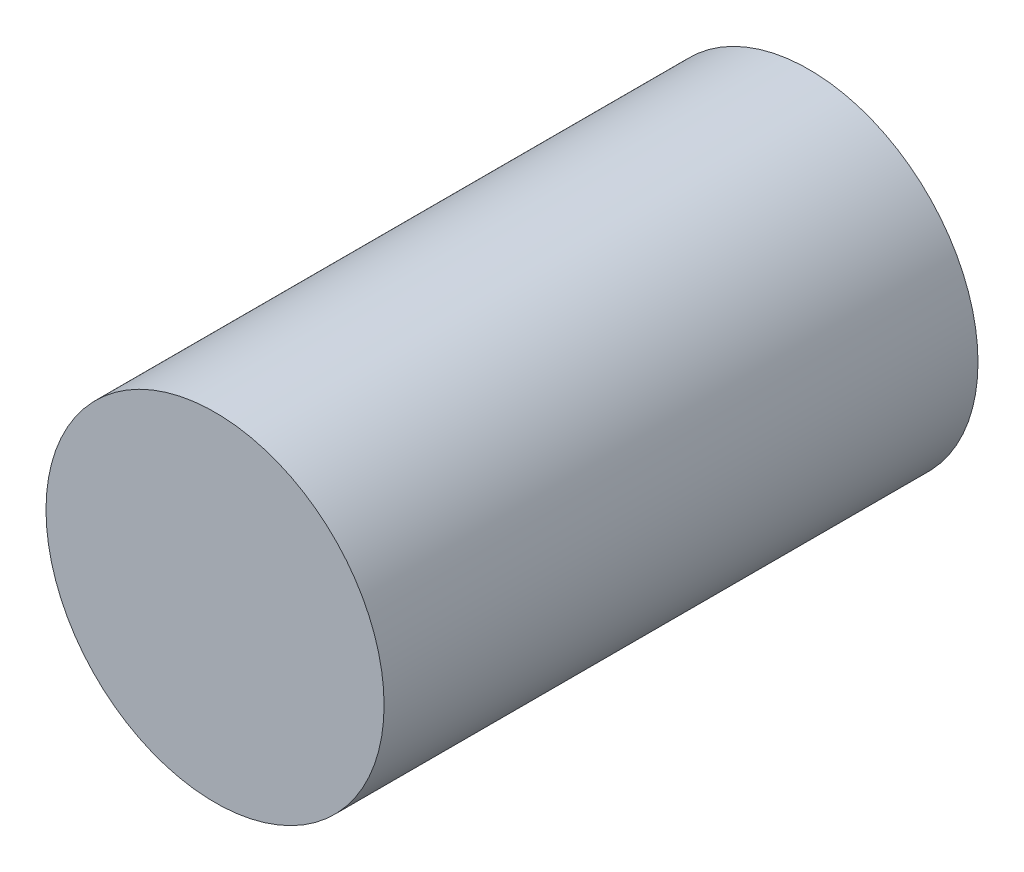
ISO-10303-21;
HEADER;
FILE_DESCRIPTION(('STEP AP214'),'2;1');
FILE_NAME('part.step','',(''),(''),'','','');
FILE_SCHEMA(('AUTOMOTIVE_DESIGN { 1 0 10303 214 1 1 1 1 }'));
ENDSEC;
DATA;
#1=APPLICATION_CONTEXT('core data for automotive mechanical design processes');
#2=APPLICATION_PROTOCOL_DEFINITION('international standard','automotive_design',2000,#1);
#3=PRODUCT_CONTEXT('',#1,'mechanical');
#4=PRODUCT('Part','Part','',(#3));
#5=PRODUCT_RELATED_PRODUCT_CATEGORY('part','',(#4));
#6=PRODUCT_DEFINITION_FORMATION('','',#4);
#7=PRODUCT_DEFINITION_CONTEXT('part definition',#1,'design');
#8=PRODUCT_DEFINITION('design','',#6,#7);
#9=PRODUCT_DEFINITION_SHAPE('','',#8);
#10=(LENGTH_UNIT() NAMED_UNIT(*) SI_UNIT(.MILLI.,.METRE.));
#11=(NAMED_UNIT(*) PLANE_ANGLE_UNIT() SI_UNIT($,.RADIAN.));
#12=(NAMED_UNIT(*) SI_UNIT($,.STERADIAN.) SOLID_ANGLE_UNIT());
#13=UNCERTAINTY_MEASURE_WITH_UNIT(LENGTH_MEASURE(1.E-05),#10,'distance_accuracy_value','');
#14=(GEOMETRIC_REPRESENTATION_CONTEXT(3) GLOBAL_UNCERTAINTY_ASSIGNED_CONTEXT((#13)) GLOBAL_UNIT_ASSIGNED_CONTEXT((#10,
#11,#12)) REPRESENTATION_CONTEXT('',''));
#15=CARTESIAN_POINT('',(0.,0.,0.));
#16=DIRECTION('',(0.,0.,1.));
#17=DIRECTION('',(1.,0.,0.));
#18=AXIS2_PLACEMENT_3D('',#15,#16,#17);
#19=CARTESIAN_POINT('',(0.,0.,65.));
#20=DIRECTION('',(0.,0.,-1.));
#21=DIRECTION('',(-1.,0.,0.));
#22=AXIS2_PLACEMENT_3D('',#19,#20,#21);
#23=CYLINDRICAL_SURFACE('',#22,18.5);
#24=CARTESIAN_POINT('',(0.,0.,65.));
#25=DIRECTION('',(0.,0.,1.));
#26=DIRECTION('',(1.,0.,0.));
#27=AXIS2_PLACEMENT_3D('',#24,#25,#26);
#28=CIRCLE('',#27,18.5);
#29=CARTESIAN_POINT('',(18.5,0.,65.));
#30=VERTEX_POINT('',#29);
#31=EDGE_CURVE('E10',#30,#30,#28,.T.);
#32=ORIENTED_EDGE('',*,*,#31,.F.);
#33=EDGE_LOOP('',(#32));
#34=FACE_BOUND('',#33,.T.);
#35=CARTESIAN_POINT('',(0.,0.,0.));
#36=DIRECTION('',(0.,0.,1.));
#37=DIRECTION('',(1.,0.,0.));
#38=AXIS2_PLACEMENT_3D('',#35,#36,#37);
#39=CIRCLE('',#38,18.5);
#40=CARTESIAN_POINT('',(18.5,0.,0.));
#41=VERTEX_POINT('',#40);
#42=EDGE_CURVE('E32',#41,#41,#39,.T.);
#43=ORIENTED_EDGE('',*,*,#42,.T.);
#44=EDGE_LOOP('',(#43));
#45=FACE_BOUND('',#44,.T.);
#46=ADVANCED_FACE('F29',(#34,#45),#23,.T.);
#47=CARTESIAN_POINT('',(0.,0.,65.));
#48=DIRECTION('',(0.,0.,1.));
#49=DIRECTION('',(1.,0.,0.));
#50=AXIS2_PLACEMENT_3D('',#47,#48,#49);
#51=PLANE('',#50);
#52=ORIENTED_EDGE('',*,*,#31,.T.);
#53=EDGE_LOOP('',(#52));
#54=FACE_BOUND('',#53,.T.);
#55=ADVANCED_FACE('F44',(#54),#51,.T.);
#56=CARTESIAN_POINT('',(0.,0.,0.));
#57=DIRECTION('',(0.,0.,1.));
#58=DIRECTION('',(1.,0.,0.));
#59=AXIS2_PLACEMENT_3D('',#56,#57,#58);
#60=PLANE('',#59);
#61=ORIENTED_EDGE('',*,*,#42,.F.);
#62=EDGE_LOOP('',(#61));
#63=FACE_BOUND('',#62,.T.);
#64=ADVANCED_FACE('F42',(#63),#60,.F.);
#65=CLOSED_SHELL('',(#46,#55,#64));
#66=MANIFOLD_SOLID_BREP('B2',#65);
#67=ADVANCED_BREP_SHAPE_REPRESENTATION('',(#18,#66),#14);
#68=SHAPE_DEFINITION_REPRESENTATION(#9,#67);
ENDSEC;
END-ISO-10303-21;
